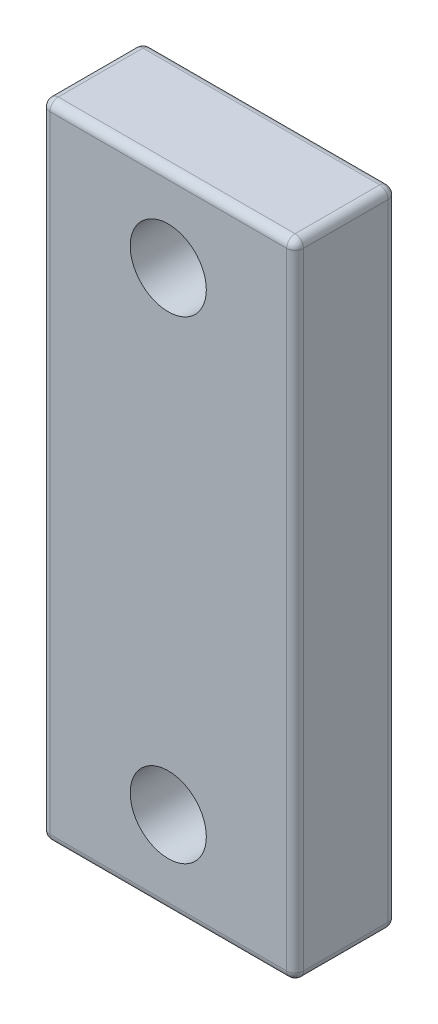
ISO-10303-21;
HEADER;
FILE_DESCRIPTION(('STEP AP214'),'2;1');
FILE_NAME('part.step','',(''),(''),'','','');
FILE_SCHEMA(('AUTOMOTIVE_DESIGN { 1 0 10303 214 1 1 1 1 }'));
ENDSEC;
DATA;
#1=APPLICATION_CONTEXT('core data for automotive mechanical design processes');
#2=APPLICATION_PROTOCOL_DEFINITION('international standard','automotive_design',2000,#1);
#3=PRODUCT_CONTEXT('',#1,'mechanical');
#4=PRODUCT('Part','Part','',(#3));
#5=PRODUCT_RELATED_PRODUCT_CATEGORY('part','',(#4));
#6=PRODUCT_DEFINITION_FORMATION('','',#4);
#7=PRODUCT_DEFINITION_CONTEXT('part definition',#1,'design');
#8=PRODUCT_DEFINITION('design','',#6,#7);
#9=PRODUCT_DEFINITION_SHAPE('','',#8);
#10=(LENGTH_UNIT() NAMED_UNIT(*) SI_UNIT(.MILLI.,.METRE.));
#11=(NAMED_UNIT(*) PLANE_ANGLE_UNIT() SI_UNIT($,.RADIAN.));
#12=(NAMED_UNIT(*) SI_UNIT($,.STERADIAN.) SOLID_ANGLE_UNIT());
#13=UNCERTAINTY_MEASURE_WITH_UNIT(LENGTH_MEASURE(1.E-05),#10,'distance_accuracy_value','');
#14=(GEOMETRIC_REPRESENTATION_CONTEXT(3) GLOBAL_UNCERTAINTY_ASSIGNED_CONTEXT((#13)) GLOBAL_UNIT_ASSIGNED_CONTEXT((#10,
#11,#12)) REPRESENTATION_CONTEXT('',''));
#15=CARTESIAN_POINT('',(0.,0.,0.));
#16=DIRECTION('',(0.,0.,1.));
#17=DIRECTION('',(1.,0.,0.));
#18=AXIS2_PLACEMENT_3D('',#15,#16,#17);
#19=CARTESIAN_POINT('',(0.,0.,-3.));
#20=DIRECTION('',(0.,0.,-1.));
#21=DIRECTION('',(-1.,0.,0.));
#22=AXIS2_PLACEMENT_3D('',#19,#20,#21);
#23=PLANE('',#22);
#24=CARTESIAN_POINT('',(0.,-14.,-3.));
#25=DIRECTION('',(0.,0.,1.));
#26=DIRECTION('',(1.,0.,0.));
#27=AXIS2_PLACEMENT_3D('',#24,#25,#26);
#28=CIRCLE('',#27,2.25);
#29=CARTESIAN_POINT('',(2.24999999999999,-14.,-3.));
#30=VERTEX_POINT('',#29);
#31=EDGE_CURVE('E243',#30,#30,#28,.T.);
#32=ORIENTED_EDGE('',*,*,#31,.T.);
#33=EDGE_LOOP('',(#32));
#34=FACE_BOUND('',#33,.T.);
#35=DIRECTION('',(-1.,0.,0.));
#36=VECTOR('',#35,1.);
#37=CARTESIAN_POINT('',(-2.,-10.5,-3.));
#38=LINE('',#37,#36);
#39=CARTESIAN_POINT('',(7.,-10.5,-3.));
#40=VERTEX_POINT('',#39);
#41=CARTESIAN_POINT('',(-7.,-10.5,-3.));
#42=VERTEX_POINT('',#41);
#43=EDGE_CURVE('E66',#40,#42,#38,.T.);
#44=ORIENTED_EDGE('',*,*,#43,.F.);
#45=DIRECTION('',(0.,1.,0.));
#46=VECTOR('',#45,1.);
#47=CARTESIAN_POINT('',(7.,-19.,-3.));
#48=LINE('',#47,#46);
#49=CARTESIAN_POINT('',(7.,-18.5,-3.));
#50=VERTEX_POINT('',#49);
#51=EDGE_CURVE('E275',#40,#50,#48,.F.);
#52=ORIENTED_EDGE('',*,*,#51,.T.);
#53=DIRECTION('',(1.,0.,0.));
#54=VECTOR('',#53,1.);
#55=CARTESIAN_POINT('',(-7.5,-18.5,-3.));
#56=LINE('',#55,#54);
#57=CARTESIAN_POINT('',(-7.,-18.5,-3.));
#58=VERTEX_POINT('',#57);
#59=EDGE_CURVE('E279',#50,#58,#56,.F.);
#60=ORIENTED_EDGE('',*,*,#59,.T.);
#61=DIRECTION('',(0.,-1.,0.));
#62=VECTOR('',#61,1.);
#63=CARTESIAN_POINT('',(-7.,19.,-3.));
#64=LINE('',#63,#62);
#65=EDGE_CURVE('E272',#58,#42,#64,.F.);
#66=ORIENTED_EDGE('',*,*,#65,.T.);
#67=EDGE_LOOP('',(#44,#52,#60,#66));
#68=FACE_BOUND('',#67,.T.);
#69=ADVANCED_FACE('F41',(#34,#68),#23,.T.);
#70=CARTESIAN_POINT('',(7.,18.5,-3.));
#71=VERTEX_POINT('',#70);
#72=CARTESIAN_POINT('',(7.,10.5,-3.));
#73=VERTEX_POINT('',#72);
#74=EDGE_CURVE('E276',#71,#73,#48,.F.);
#75=ORIENTED_EDGE('',*,*,#74,.T.);
#76=DIRECTION('',(-1.,0.,0.));
#77=VECTOR('',#76,1.);
#78=CARTESIAN_POINT('',(-2.,10.5,-3.));
#79=LINE('',#78,#77);
#80=CARTESIAN_POINT('',(-7.,10.5,-3.));
#81=VERTEX_POINT('',#80);
#82=EDGE_CURVE('E220',#73,#81,#79,.T.);
#83=ORIENTED_EDGE('',*,*,#82,.T.);
#84=CARTESIAN_POINT('',(-7.,18.5,-3.));
#85=VERTEX_POINT('',#84);
#86=EDGE_CURVE('E271',#81,#85,#64,.F.);
#87=ORIENTED_EDGE('',*,*,#86,.T.);
#88=DIRECTION('',(-1.,0.,0.));
#89=VECTOR('',#88,1.);
#90=CARTESIAN_POINT('',(7.5,18.5,-3.));
#91=LINE('',#90,#89);
#92=EDGE_CURVE('E269',#85,#71,#91,.F.);
#93=ORIENTED_EDGE('',*,*,#92,.T.);
#94=EDGE_LOOP('',(#75,#83,#87,#93));
#95=FACE_BOUND('',#94,.T.);
#96=CARTESIAN_POINT('',(0.,14.,-3.));
#97=DIRECTION('',(0.,0.,1.));
#98=DIRECTION('',(1.,0.,0.));
#99=AXIS2_PLACEMENT_3D('',#96,#97,#98);
#100=CIRCLE('',#99,2.25);
#101=CARTESIAN_POINT('',(2.24999999999999,14.,-3.));
#102=VERTEX_POINT('',#101);
#103=EDGE_CURVE('E242',#102,#102,#100,.T.);
#104=ORIENTED_EDGE('',*,*,#103,.T.);
#105=EDGE_LOOP('',(#104));
#106=FACE_BOUND('',#105,.T.);
#107=ADVANCED_FACE('F419',(#95,#106),#23,.T.);
#108=CARTESIAN_POINT('',(0.,0.,3.));
#109=DIRECTION('',(0.,0.,-1.));
#110=DIRECTION('',(-1.,0.,0.));
#111=AXIS2_PLACEMENT_3D('',#108,#109,#110);
#112=PLANE('',#111);
#113=DIRECTION('',(0.,-1.,0.));
#114=VECTOR('',#113,1.);
#115=CARTESIAN_POINT('',(-7.,0.,3.));
#116=LINE('',#115,#114);
#117=CARTESIAN_POINT('',(-7.,18.5,3.));
#118=VERTEX_POINT('',#117);
#119=CARTESIAN_POINT('',(-7.,-18.5,3.));
#120=VERTEX_POINT('',#119);
#121=EDGE_CURVE('E253',#118,#120,#116,.T.);
#122=ORIENTED_EDGE('',*,*,#121,.T.);
#123=DIRECTION('',(1.,0.,0.));
#124=VECTOR('',#123,1.);
#125=CARTESIAN_POINT('',(0.,-18.5,3.));
#126=LINE('',#125,#124);
#127=CARTESIAN_POINT('',(7.,-18.5,3.));
#128=VERTEX_POINT('',#127);
#129=EDGE_CURVE('E257',#120,#128,#126,.T.);
#130=ORIENTED_EDGE('',*,*,#129,.T.);
#131=DIRECTION('',(0.,1.,0.));
#132=VECTOR('',#131,1.);
#133=CARTESIAN_POINT('',(7.,0.,3.));
#134=LINE('',#133,#132);
#135=CARTESIAN_POINT('',(7.,18.5,3.));
#136=VERTEX_POINT('',#135);
#137=EDGE_CURVE('E255',#128,#136,#134,.T.);
#138=ORIENTED_EDGE('',*,*,#137,.T.);
#139=DIRECTION('',(-1.,0.,0.));
#140=VECTOR('',#139,1.);
#141=CARTESIAN_POINT('',(0.,18.5,3.));
#142=LINE('',#141,#140);
#143=EDGE_CURVE('E249',#136,#118,#142,.T.);
#144=ORIENTED_EDGE('',*,*,#143,.T.);
#145=EDGE_LOOP('',(#122,#130,#138,#144));
#146=FACE_BOUND('',#145,.T.);
#147=CARTESIAN_POINT('',(0.,14.,3.));
#148=DIRECTION('',(0.,0.,1.));
#149=DIRECTION('',(1.,0.,0.));
#150=AXIS2_PLACEMENT_3D('',#147,#148,#149);
#151=CIRCLE('',#150,2.25);
#152=CARTESIAN_POINT('',(2.24999999999999,14.,3.));
#153=VERTEX_POINT('',#152);
#154=EDGE_CURVE('E246',#153,#153,#151,.T.);
#155=ORIENTED_EDGE('',*,*,#154,.F.);
#156=EDGE_LOOP('',(#155));
#157=FACE_BOUND('',#156,.T.);
#158=CARTESIAN_POINT('',(0.,-14.,3.));
#159=DIRECTION('',(0.,0.,1.));
#160=DIRECTION('',(1.,0.,0.));
#161=AXIS2_PLACEMENT_3D('',#158,#159,#160);
#162=CIRCLE('',#161,2.25);
#163=CARTESIAN_POINT('',(2.24999999999999,-14.,3.));
#164=VERTEX_POINT('',#163);
#165=EDGE_CURVE('E239',#164,#164,#162,.T.);
#166=ORIENTED_EDGE('',*,*,#165,.F.);
#167=EDGE_LOOP('',(#166));
#168=FACE_BOUND('',#167,.T.);
#169=ADVANCED_FACE('F438',(#146,#157,#168),#112,.F.);
#170=CARTESIAN_POINT('',(7.5,-19.,3.));
#171=DIRECTION('',(-1.,0.,0.));
#172=DIRECTION('',(0.,-1.,0.));
#173=AXIS2_PLACEMENT_3D('',#170,#171,#172);
#174=PLANE('',#173);
#175=DIRECTION('',(0.,1.,0.));
#176=VECTOR('',#175,1.);
#177=CARTESIAN_POINT('',(7.5,-19.,2.5));
#178=LINE('',#177,#176);
#179=CARTESIAN_POINT('',(7.5,18.5,2.5));
#180=VERTEX_POINT('',#179);
#181=CARTESIAN_POINT('',(7.5,-18.5,2.5));
#182=VERTEX_POINT('',#181);
#183=EDGE_CURVE('E286',#180,#182,#178,.F.);
#184=ORIENTED_EDGE('',*,*,#183,.T.);
#185=DIRECTION('',(0.,0.,-1.));
#186=VECTOR('',#185,1.);
#187=CARTESIAN_POINT('',(7.5,-18.5,3.));
#188=LINE('',#187,#186);
#189=CARTESIAN_POINT('',(7.5,-18.5,-2.5));
#190=VERTEX_POINT('',#189);
#191=EDGE_CURVE('E288',#182,#190,#188,.T.);
#192=ORIENTED_EDGE('',*,*,#191,.T.);
#193=DIRECTION('',(0.,1.,0.));
#194=VECTOR('',#193,1.);
#195=CARTESIAN_POINT('',(7.5,19.,-2.5));
#196=LINE('',#195,#194);
#197=CARTESIAN_POINT('',(7.5,18.5,-2.5));
#198=VERTEX_POINT('',#197);
#199=EDGE_CURVE('E284',#190,#198,#196,.T.);
#200=ORIENTED_EDGE('',*,*,#199,.T.);
#201=DIRECTION('',(0.,0.,-1.));
#202=VECTOR('',#201,1.);
#203=CARTESIAN_POINT('',(7.5,18.5,3.));
#204=LINE('',#203,#202);
#205=EDGE_CURVE('E282',#198,#180,#204,.F.);
#206=ORIENTED_EDGE('',*,*,#205,.T.);
#207=EDGE_LOOP('',(#184,#192,#200,#206));
#208=FACE_BOUND('',#207,.T.);
#209=ADVANCED_FACE('F450',(#208),#174,.F.);
#210=CARTESIAN_POINT('',(-7.5,19.,3.));
#211=DIRECTION('',(0.,-1.,0.));
#212=DIRECTION('',(0.,0.,-1.));
#213=AXIS2_PLACEMENT_3D('',#210,#211,#212);
#214=PLANE('',#213);
#215=DIRECTION('',(-1.,0.,0.));
#216=VECTOR('',#215,1.);
#217=CARTESIAN_POINT('',(-7.5,19.,2.5));
#218=LINE('',#217,#216);
#219=CARTESIAN_POINT('',(-7.,19.,2.5));
#220=VERTEX_POINT('',#219);
#221=CARTESIAN_POINT('',(7.,19.,2.5));
#222=VERTEX_POINT('',#221);
#223=EDGE_CURVE('E50',#220,#222,#218,.F.);
#224=ORIENTED_EDGE('',*,*,#223,.T.);
#225=DIRECTION('',(0.,0.,-1.));
#226=VECTOR('',#225,1.);
#227=CARTESIAN_POINT('',(7.,19.,3.));
#228=LINE('',#227,#226);
#229=CARTESIAN_POINT('',(7.,19.,-2.5));
#230=VERTEX_POINT('',#229);
#231=EDGE_CURVE('E11',#222,#230,#228,.T.);
#232=ORIENTED_EDGE('',*,*,#231,.T.);
#233=DIRECTION('',(-1.,0.,0.));
#234=VECTOR('',#233,1.);
#235=CARTESIAN_POINT('',(-7.5,19.,-2.5));
#236=LINE('',#235,#234);
#237=CARTESIAN_POINT('',(-7.,19.,-2.5));
#238=VERTEX_POINT('',#237);
#239=EDGE_CURVE('E300',#230,#238,#236,.T.);
#240=ORIENTED_EDGE('',*,*,#239,.T.);
#241=DIRECTION('',(0.,0.,-1.));
#242=VECTOR('',#241,1.);
#243=CARTESIAN_POINT('',(-7.,19.,3.));
#244=LINE('',#243,#242);
#245=EDGE_CURVE('E302',#238,#220,#244,.F.);
#246=ORIENTED_EDGE('',*,*,#245,.T.);
#247=EDGE_LOOP('',(#224,#232,#240,#246));
#248=FACE_BOUND('',#247,.T.);
#249=ADVANCED_FACE('F397',(#248),#214,.F.);
#250=CARTESIAN_POINT('',(-7.5,-19.,3.));
#251=DIRECTION('',(1.,0.,0.));
#252=DIRECTION('',(0.,0.,-1.));
#253=AXIS2_PLACEMENT_3D('',#250,#251,#252);
#254=PLANE('',#253);
#255=DIRECTION('',(0.,0.,-1.));
#256=VECTOR('',#255,1.);
#257=CARTESIAN_POINT('',(-7.5,-18.5,3.));
#258=LINE('',#257,#256);
#259=CARTESIAN_POINT('',(-7.5,-18.5,-2.5));
#260=VERTEX_POINT('',#259);
#261=CARTESIAN_POINT('',(-7.5,-18.5,2.5));
#262=VERTEX_POINT('',#261);
#263=EDGE_CURVE('E295',#260,#262,#258,.F.);
#264=ORIENTED_EDGE('',*,*,#263,.T.);
#265=DIRECTION('',(0.,-1.,0.));
#266=VECTOR('',#265,1.);
#267=CARTESIAN_POINT('',(-7.5,-19.,2.5));
#268=LINE('',#267,#266);
#269=CARTESIAN_POINT('',(-7.5,18.5,2.5));
#270=VERTEX_POINT('',#269);
#271=EDGE_CURVE('E297',#262,#270,#268,.F.);
#272=ORIENTED_EDGE('',*,*,#271,.T.);
#273=DIRECTION('',(0.,0.,-1.));
#274=VECTOR('',#273,1.);
#275=CARTESIAN_POINT('',(-7.5,18.5,3.));
#276=LINE('',#275,#274);
#277=CARTESIAN_POINT('',(-7.5,18.5,-2.5));
#278=VERTEX_POINT('',#277);
#279=EDGE_CURVE('E291',#270,#278,#276,.T.);
#280=ORIENTED_EDGE('',*,*,#279,.T.);
#281=DIRECTION('',(0.,-1.,0.));
#282=VECTOR('',#281,1.);
#283=CARTESIAN_POINT('',(-7.5,-19.,-2.5));
#284=LINE('',#283,#282);
#285=EDGE_CURVE('E293',#278,#260,#284,.T.);
#286=ORIENTED_EDGE('',*,*,#285,.T.);
#287=EDGE_LOOP('',(#264,#272,#280,#286));
#288=FACE_BOUND('',#287,.T.);
#289=ADVANCED_FACE('F388',(#288),#254,.F.);
#290=CARTESIAN_POINT('',(-7.5,-19.,3.));
#291=DIRECTION('',(0.,1.,0.));
#292=DIRECTION('',(0.,0.,1.));
#293=AXIS2_PLACEMENT_3D('',#290,#291,#292);
#294=PLANE('',#293);
#295=DIRECTION('',(1.,0.,0.));
#296=VECTOR('',#295,1.);
#297=CARTESIAN_POINT('',(7.5,-19.,-2.5));
#298=LINE('',#297,#296);
#299=CARTESIAN_POINT('',(-7.,-19.,-2.5));
#300=VERTEX_POINT('',#299);
#301=CARTESIAN_POINT('',(7.,-19.,-2.5));
#302=VERTEX_POINT('',#301);
#303=EDGE_CURVE('E262',#300,#302,#298,.T.);
#304=ORIENTED_EDGE('',*,*,#303,.T.);
#305=DIRECTION('',(0.,0.,-1.));
#306=VECTOR('',#305,1.);
#307=CARTESIAN_POINT('',(7.,-19.,3.));
#308=LINE('',#307,#306);
#309=CARTESIAN_POINT('',(7.,-19.,2.5));
#310=VERTEX_POINT('',#309);
#311=EDGE_CURVE('E267',#302,#310,#308,.F.);
#312=ORIENTED_EDGE('',*,*,#311,.T.);
#313=DIRECTION('',(1.,0.,0.));
#314=VECTOR('',#313,1.);
#315=CARTESIAN_POINT('',(-7.5,-19.,2.5));
#316=LINE('',#315,#314);
#317=CARTESIAN_POINT('',(-7.,-19.,2.5));
#318=VERTEX_POINT('',#317);
#319=EDGE_CURVE('E264',#310,#318,#316,.F.);
#320=ORIENTED_EDGE('',*,*,#319,.T.);
#321=DIRECTION('',(0.,0.,-1.));
#322=VECTOR('',#321,1.);
#323=CARTESIAN_POINT('',(-7.,-19.,3.));
#324=LINE('',#323,#322);
#325=EDGE_CURVE('E260',#318,#300,#324,.T.);
#326=ORIENTED_EDGE('',*,*,#325,.T.);
#327=EDGE_LOOP('',(#304,#312,#320,#326));
#328=FACE_BOUND('',#327,.T.);
#329=ADVANCED_FACE('F443',(#328),#294,.F.);
#330=CARTESIAN_POINT('',(0.,14.,3.));
#331=DIRECTION('',(0.,0.,-1.));
#332=DIRECTION('',(-1.,0.,0.));
#333=AXIS2_PLACEMENT_3D('',#330,#331,#332);
#334=CYLINDRICAL_SURFACE('',#333,2.25);
#335=ORIENTED_EDGE('',*,*,#154,.T.);
#336=EDGE_LOOP('',(#335));
#337=FACE_BOUND('',#336,.T.);
#338=ORIENTED_EDGE('',*,*,#103,.F.);
#339=EDGE_LOOP('',(#338));
#340=FACE_BOUND('',#339,.T.);
#341=ADVANCED_FACE('F428',(#337,#340),#334,.F.);
#342=CARTESIAN_POINT('',(0.,-14.,3.));
#343=DIRECTION('',(0.,0.,-1.));
#344=DIRECTION('',(-1.,0.,0.));
#345=AXIS2_PLACEMENT_3D('',#342,#343,#344);
#346=CYLINDRICAL_SURFACE('',#345,2.25);
#347=ORIENTED_EDGE('',*,*,#165,.T.);
#348=EDGE_LOOP('',(#347));
#349=FACE_BOUND('',#348,.T.);
#350=ORIENTED_EDGE('',*,*,#31,.F.);
#351=EDGE_LOOP('',(#350));
#352=FACE_BOUND('',#351,.T.);
#353=ADVANCED_FACE('F422',(#349,#352),#346,.F.);
#354=CARTESIAN_POINT('',(-7.5,18.5,-2.5));
#355=DIRECTION('',(1.,0.,0.));
#356=DIRECTION('',(0.,0.,-1.));
#357=AXIS2_PLACEMENT_3D('',#354,#355,#356);
#358=CYLINDRICAL_SURFACE('',#357,0.5);
#359=CARTESIAN_POINT('',(-7.,18.5,-2.5));
#360=DIRECTION('',(-1.,0.,0.));
#361=DIRECTION('',(0.,0.,1.));
#362=AXIS2_PLACEMENT_3D('',#359,#360,#361);
#363=CIRCLE('',#362,0.5);
#364=EDGE_CURVE('E45',#238,#85,#363,.T.);
#365=ORIENTED_EDGE('',*,*,#364,.F.);
#366=ORIENTED_EDGE('',*,*,#239,.F.);
#367=CARTESIAN_POINT('',(7.,18.5,-2.5));
#368=DIRECTION('',(1.,0.,0.));
#369=DIRECTION('',(0.,1.,0.));
#370=AXIS2_PLACEMENT_3D('',#367,#368,#369);
#371=CIRCLE('',#370,0.5);
#372=EDGE_CURVE('E363',#71,#230,#371,.T.);
#373=ORIENTED_EDGE('',*,*,#372,.F.);
#374=ORIENTED_EDGE('',*,*,#92,.F.);
#375=EDGE_LOOP('',(#365,#366,#373,#374));
#376=FACE_BOUND('',#375,.T.);
#377=ADVANCED_FACE('F43',(#376),#358,.T.);
#378=CARTESIAN_POINT('',(-7.,18.5,-2.5));
#379=DIRECTION('',(0.,0.,-1.));
#380=DIRECTION('',(-1.,0.,0.));
#381=AXIS2_PLACEMENT_3D('',#378,#379,#380);
#382=SPHERICAL_SURFACE('',#381,0.5);
#383=CARTESIAN_POINT('',(-7.,18.5,-2.5));
#384=DIRECTION('',(0.,0.,-1.));
#385=DIRECTION('',(-1.,0.,0.));
#386=AXIS2_PLACEMENT_3D('',#383,#384,#385);
#387=CIRCLE('',#386,0.5);
#388=EDGE_CURVE('E358',#238,#278,#387,.F.);
#389=ORIENTED_EDGE('',*,*,#388,.F.);
#390=ORIENTED_EDGE('',*,*,#364,.T.);
#391=CARTESIAN_POINT('',(-7.,18.5,-2.5));
#392=DIRECTION('',(0.,1.,0.));
#393=DIRECTION('',(0.,0.,1.));
#394=AXIS2_PLACEMENT_3D('',#391,#392,#393);
#395=CIRCLE('',#394,0.5);
#396=EDGE_CURVE('E361',#278,#85,#395,.F.);
#397=ORIENTED_EDGE('',*,*,#396,.F.);
#398=EDGE_LOOP('',(#389,#390,#397));
#399=FACE_BOUND('',#398,.T.);
#400=ADVANCED_FACE('F375',(#399),#382,.T.);
#401=CARTESIAN_POINT('',(7.,18.5,-2.5));
#402=DIRECTION('',(0.,1.,0.));
#403=DIRECTION('',(-1.,0.,0.));
#404=AXIS2_PLACEMENT_3D('',#401,#402,#403);
#405=SPHERICAL_SURFACE('',#404,0.5);
#406=CARTESIAN_POINT('',(7.,18.5,-2.5));
#407=DIRECTION('',(0.,1.,0.));
#408=DIRECTION('',(0.,0.,1.));
#409=AXIS2_PLACEMENT_3D('',#406,#407,#408);
#410=CIRCLE('',#409,0.5);
#411=EDGE_CURVE('E353',#71,#198,#410,.F.);
#412=ORIENTED_EDGE('',*,*,#411,.F.);
#413=ORIENTED_EDGE('',*,*,#372,.T.);
#414=CARTESIAN_POINT('',(7.,18.5,-2.5));
#415=DIRECTION('',(0.,0.,-1.));
#416=DIRECTION('',(-1.,0.,0.));
#417=AXIS2_PLACEMENT_3D('',#414,#415,#416);
#418=CIRCLE('',#417,0.5);
#419=EDGE_CURVE('E356',#198,#230,#418,.F.);
#420=ORIENTED_EDGE('',*,*,#419,.F.);
#421=EDGE_LOOP('',(#412,#413,#420));
#422=FACE_BOUND('',#421,.T.);
#423=ADVANCED_FACE('F413',(#422),#405,.T.);
#424=CARTESIAN_POINT('',(-7.,-19.,-2.5));
#425=DIRECTION('',(0.,1.,0.));
#426=DIRECTION('',(0.,0.,1.));
#427=AXIS2_PLACEMENT_3D('',#424,#425,#426);
#428=CYLINDRICAL_SURFACE('',#427,0.5);
#429=ORIENTED_EDGE('',*,*,#396,.T.);
#430=ORIENTED_EDGE('',*,*,#86,.F.);
#431=DIRECTION('',(0.,1.,0.));
#432=VECTOR('',#431,1.);
#433=CARTESIAN_POINT('',(-7.,-10.5,-3.));
#434=LINE('',#433,#432);
#435=EDGE_CURVE('E227',#42,#81,#434,.T.);
#436=ORIENTED_EDGE('',*,*,#435,.F.);
#437=ORIENTED_EDGE('',*,*,#65,.F.);
#438=CARTESIAN_POINT('',(-7.,-18.5,-2.5));
#439=DIRECTION('',(0.,-1.,0.));
#440=DIRECTION('',(0.,0.,-1.));
#441=AXIS2_PLACEMENT_3D('',#438,#439,#440);
#442=CIRCLE('',#441,0.5);
#443=EDGE_CURVE('E348',#260,#58,#442,.T.);
#444=ORIENTED_EDGE('',*,*,#443,.F.);
#445=ORIENTED_EDGE('',*,*,#285,.F.);
#446=EDGE_LOOP('',(#429,#430,#436,#437,#444,#445));
#447=FACE_BOUND('',#446,.T.);
#448=ADVANCED_FACE('F382',(#447),#428,.T.);
#449=CARTESIAN_POINT('',(-7.,18.5,3.));
#450=DIRECTION('',(0.,0.,-1.));
#451=DIRECTION('',(-1.,0.,0.));
#452=AXIS2_PLACEMENT_3D('',#449,#450,#451);
#453=CYLINDRICAL_SURFACE('',#452,0.5);
#454=ORIENTED_EDGE('',*,*,#388,.T.);
#455=ORIENTED_EDGE('',*,*,#279,.F.);
#456=CARTESIAN_POINT('',(-7.,18.5,2.5));
#457=DIRECTION('',(0.,0.,1.));
#458=DIRECTION('',(1.,0.,0.));
#459=AXIS2_PLACEMENT_3D('',#456,#457,#458);
#460=CIRCLE('',#459,0.5);
#461=EDGE_CURVE('E345',#220,#270,#460,.T.);
#462=ORIENTED_EDGE('',*,*,#461,.F.);
#463=ORIENTED_EDGE('',*,*,#245,.F.);
#464=EDGE_LOOP('',(#454,#455,#462,#463));
#465=FACE_BOUND('',#464,.T.);
#466=ADVANCED_FACE('F394',(#465),#453,.T.);
#467=CARTESIAN_POINT('',(0.,18.5,2.5));
#468=DIRECTION('',(-1.,0.,0.));
#469=DIRECTION('',(0.,0.,1.));
#470=AXIS2_PLACEMENT_3D('',#467,#468,#469);
#471=CYLINDRICAL_SURFACE('',#470,0.5);
#472=CARTESIAN_POINT('',(7.,18.5,2.5));
#473=DIRECTION('',(1.,0.,0.));
#474=DIRECTION('',(0.,0.,-1.));
#475=AXIS2_PLACEMENT_3D('',#472,#473,#474);
#476=CIRCLE('',#475,0.5);
#477=EDGE_CURVE('E339',#222,#136,#476,.T.);
#478=ORIENTED_EDGE('',*,*,#477,.F.);
#479=ORIENTED_EDGE('',*,*,#223,.F.);
#480=CARTESIAN_POINT('',(-7.,18.5,2.5));
#481=DIRECTION('',(-1.,0.,0.));
#482=DIRECTION('',(0.,0.,1.));
#483=AXIS2_PLACEMENT_3D('',#480,#481,#482);
#484=CIRCLE('',#483,0.5);
#485=EDGE_CURVE('E342',#118,#220,#484,.T.);
#486=ORIENTED_EDGE('',*,*,#485,.F.);
#487=ORIENTED_EDGE('',*,*,#143,.F.);
#488=EDGE_LOOP('',(#478,#479,#486,#487));
#489=FACE_BOUND('',#488,.T.);
#490=ADVANCED_FACE('F402',(#489),#471,.T.);
#491=CARTESIAN_POINT('',(7.,18.5,3.));
#492=DIRECTION('',(0.,0.,-1.));
#493=DIRECTION('',(-1.,0.,0.));
#494=AXIS2_PLACEMENT_3D('',#491,#492,#493);
#495=CYLINDRICAL_SURFACE('',#494,0.5);
#496=ORIENTED_EDGE('',*,*,#419,.T.);
#497=ORIENTED_EDGE('',*,*,#231,.F.);
#498=CARTESIAN_POINT('',(7.,18.5,2.5));
#499=DIRECTION('',(0.,0.,1.));
#500=DIRECTION('',(1.,0.,0.));
#501=AXIS2_PLACEMENT_3D('',#498,#499,#500);
#502=CIRCLE('',#501,0.5);
#503=EDGE_CURVE('E336',#180,#222,#502,.T.);
#504=ORIENTED_EDGE('',*,*,#503,.F.);
#505=ORIENTED_EDGE('',*,*,#205,.F.);
#506=EDGE_LOOP('',(#496,#497,#504,#505));
#507=FACE_BOUND('',#506,.T.);
#508=ADVANCED_FACE('F412',(#507),#495,.T.);
#509=CARTESIAN_POINT('',(7.,-19.,-2.5));
#510=DIRECTION('',(0.,-1.,0.));
#511=DIRECTION('',(1.,0.,0.));
#512=AXIS2_PLACEMENT_3D('',#509,#510,#511);
#513=CYLINDRICAL_SURFACE('',#512,0.5);
#514=ORIENTED_EDGE('',*,*,#411,.T.);
#515=ORIENTED_EDGE('',*,*,#199,.F.);
#516=CARTESIAN_POINT('',(7.,-18.5,-2.5));
#517=DIRECTION('',(0.,-1.,0.));
#518=DIRECTION('',(0.,0.,-1.));
#519=AXIS2_PLACEMENT_3D('',#516,#517,#518);
#520=CIRCLE('',#519,0.5);
#521=EDGE_CURVE('E333',#50,#190,#520,.T.);
#522=ORIENTED_EDGE('',*,*,#521,.F.);
#523=ORIENTED_EDGE('',*,*,#51,.F.);
#524=DIRECTION('',(0.,1.,0.));
#525=VECTOR('',#524,1.);
#526=CARTESIAN_POINT('',(7.,-10.5,-3.));
#527=LINE('',#526,#525);
#528=EDGE_CURVE('E195',#40,#73,#527,.T.);
#529=ORIENTED_EDGE('',*,*,#528,.T.);
#530=ORIENTED_EDGE('',*,*,#74,.F.);
#531=EDGE_LOOP('',(#514,#515,#522,#523,#529,#530));
#532=FACE_BOUND('',#531,.T.);
#533=ADVANCED_FACE('F417',(#532),#513,.T.);
#534=CARTESIAN_POINT('',(-7.5,-18.5,-2.5));
#535=DIRECTION('',(-1.,0.,0.));
#536=DIRECTION('',(0.,0.,1.));
#537=AXIS2_PLACEMENT_3D('',#534,#535,#536);
#538=CYLINDRICAL_SURFACE('',#537,0.5);
#539=CARTESIAN_POINT('',(-7.,-18.5,-2.5));
#540=DIRECTION('',(-1.,0.,0.));
#541=DIRECTION('',(0.,0.,1.));
#542=AXIS2_PLACEMENT_3D('',#539,#540,#541);
#543=CIRCLE('',#542,0.5);
#544=EDGE_CURVE('E350',#58,#300,#543,.T.);
#545=ORIENTED_EDGE('',*,*,#544,.F.);
#546=ORIENTED_EDGE('',*,*,#59,.F.);
#547=CARTESIAN_POINT('',(7.,-18.5,-2.5));
#548=DIRECTION('',(1.,0.,0.));
#549=DIRECTION('',(0.,0.,-1.));
#550=AXIS2_PLACEMENT_3D('',#547,#548,#549);
#551=CIRCLE('',#550,0.5);
#552=EDGE_CURVE('E330',#302,#50,#551,.T.);
#553=ORIENTED_EDGE('',*,*,#552,.F.);
#554=ORIENTED_EDGE('',*,*,#303,.F.);
#555=EDGE_LOOP('',(#545,#546,#553,#554));
#556=FACE_BOUND('',#555,.T.);
#557=ADVANCED_FACE('F496',(#556),#538,.T.);
#558=CARTESIAN_POINT('',(-7.,-18.5,-2.5));
#559=DIRECTION('',(0.,0.,-1.));
#560=DIRECTION('',(-1.,0.,0.));
#561=AXIS2_PLACEMENT_3D('',#558,#559,#560);
#562=SPHERICAL_SURFACE('',#561,0.5);
#563=ORIENTED_EDGE('',*,*,#443,.T.);
#564=ORIENTED_EDGE('',*,*,#544,.T.);
#565=CARTESIAN_POINT('',(-7.,-18.5,-2.5));
#566=DIRECTION('',(0.,0.,-1.));
#567=DIRECTION('',(-1.,0.,0.));
#568=AXIS2_PLACEMENT_3D('',#565,#566,#567);
#569=CIRCLE('',#568,0.5);
#570=EDGE_CURVE('E327',#260,#300,#569,.F.);
#571=ORIENTED_EDGE('',*,*,#570,.F.);
#572=EDGE_LOOP('',(#563,#564,#571));
#573=FACE_BOUND('',#572,.T.);
#574=ADVANCED_FACE('F492',(#573),#562,.T.);
#575=CARTESIAN_POINT('',(-7.,18.5,2.5));
#576=DIRECTION('',(0.,1.,0.));
#577=DIRECTION('',(0.,0.,1.));
#578=AXIS2_PLACEMENT_3D('',#575,#576,#577);
#579=SPHERICAL_SURFACE('',#578,0.5);
#580=ORIENTED_EDGE('',*,*,#485,.T.);
#581=ORIENTED_EDGE('',*,*,#461,.T.);
#582=CARTESIAN_POINT('',(-7.,18.5,2.5));
#583=DIRECTION('',(0.,1.,0.));
#584=DIRECTION('',(0.,0.,1.));
#585=AXIS2_PLACEMENT_3D('',#582,#583,#584);
#586=CIRCLE('',#585,0.5);
#587=EDGE_CURVE('E325',#118,#270,#586,.F.);
#588=ORIENTED_EDGE('',*,*,#587,.F.);
#589=EDGE_LOOP('',(#580,#581,#588));
#590=FACE_BOUND('',#589,.T.);
#591=ADVANCED_FACE('F489',(#590),#579,.T.);
#592=CARTESIAN_POINT('',(7.,18.5,2.5));
#593=DIRECTION('',(0.,1.,0.));
#594=DIRECTION('',(-1.,0.,0.));
#595=AXIS2_PLACEMENT_3D('',#592,#593,#594);
#596=SPHERICAL_SURFACE('',#595,0.5);
#597=ORIENTED_EDGE('',*,*,#503,.T.);
#598=ORIENTED_EDGE('',*,*,#477,.T.);
#599=CARTESIAN_POINT('',(7.,18.5,2.5));
#600=DIRECTION('',(0.,1.,0.));
#601=DIRECTION('',(0.,0.,1.));
#602=AXIS2_PLACEMENT_3D('',#599,#600,#601);
#603=CIRCLE('',#602,0.5);
#604=EDGE_CURVE('E322',#180,#136,#603,.F.);
#605=ORIENTED_EDGE('',*,*,#604,.F.);
#606=EDGE_LOOP('',(#597,#598,#605));
#607=FACE_BOUND('',#606,.T.);
#608=ADVANCED_FACE('F408',(#607),#596,.T.);
#609=CARTESIAN_POINT('',(7.,-18.5,-2.5));
#610=DIRECTION('',(0.,0.,-1.));
#611=DIRECTION('',(-1.,0.,0.));
#612=AXIS2_PLACEMENT_3D('',#609,#610,#611);
#613=SPHERICAL_SURFACE('',#612,0.5);
#614=ORIENTED_EDGE('',*,*,#552,.T.);
#615=ORIENTED_EDGE('',*,*,#521,.T.);
#616=CARTESIAN_POINT('',(7.,-18.5,-2.5));
#617=DIRECTION('',(0.,0.,-1.));
#618=DIRECTION('',(-1.,0.,0.));
#619=AXIS2_PLACEMENT_3D('',#616,#617,#618);
#620=CIRCLE('',#619,0.5);
#621=EDGE_CURVE('E320',#302,#190,#620,.F.);
#622=ORIENTED_EDGE('',*,*,#621,.F.);
#623=EDGE_LOOP('',(#614,#615,#622));
#624=FACE_BOUND('',#623,.T.);
#625=ADVANCED_FACE('F482',(#624),#613,.T.);
#626=CARTESIAN_POINT('',(-7.,-18.5,3.));
#627=DIRECTION('',(0.,0.,-1.));
#628=DIRECTION('',(-1.,0.,0.));
#629=AXIS2_PLACEMENT_3D('',#626,#627,#628);
#630=CYLINDRICAL_SURFACE('',#629,0.5);
#631=ORIENTED_EDGE('',*,*,#570,.T.);
#632=ORIENTED_EDGE('',*,*,#325,.F.);
#633=CARTESIAN_POINT('',(-7.,-18.5,2.5));
#634=DIRECTION('',(0.,0.,1.));
#635=DIRECTION('',(1.,0.,0.));
#636=AXIS2_PLACEMENT_3D('',#633,#634,#635);
#637=CIRCLE('',#636,0.5);
#638=EDGE_CURVE('E317',#262,#318,#637,.T.);
#639=ORIENTED_EDGE('',*,*,#638,.F.);
#640=ORIENTED_EDGE('',*,*,#263,.F.);
#641=EDGE_LOOP('',(#631,#632,#639,#640));
#642=FACE_BOUND('',#641,.T.);
#643=ADVANCED_FACE('F478',(#642),#630,.T.);
#644=CARTESIAN_POINT('',(-7.,0.,2.5));
#645=DIRECTION('',(0.,-1.,0.));
#646=DIRECTION('',(0.,0.,-1.));
#647=AXIS2_PLACEMENT_3D('',#644,#645,#646);
#648=CYLINDRICAL_SURFACE('',#647,0.5);
#649=ORIENTED_EDGE('',*,*,#587,.T.);
#650=ORIENTED_EDGE('',*,*,#271,.F.);
#651=CARTESIAN_POINT('',(-7.,-18.5,2.5));
#652=DIRECTION('',(0.,-1.,0.));
#653=DIRECTION('',(0.,0.,-1.));
#654=AXIS2_PLACEMENT_3D('',#651,#652,#653);
#655=CIRCLE('',#654,0.5);
#656=EDGE_CURVE('E314',#120,#262,#655,.T.);
#657=ORIENTED_EDGE('',*,*,#656,.F.);
#658=ORIENTED_EDGE('',*,*,#121,.F.);
#659=EDGE_LOOP('',(#649,#650,#657,#658));
#660=FACE_BOUND('',#659,.T.);
#661=ADVANCED_FACE('F474',(#660),#648,.T.);
#662=CARTESIAN_POINT('',(7.,0.,2.5));
#663=DIRECTION('',(0.,1.,0.));
#664=DIRECTION('',(-1.,0.,0.));
#665=AXIS2_PLACEMENT_3D('',#662,#663,#664);
#666=CYLINDRICAL_SURFACE('',#665,0.5);
#667=ORIENTED_EDGE('',*,*,#604,.T.);
#668=ORIENTED_EDGE('',*,*,#137,.F.);
#669=CARTESIAN_POINT('',(7.,-18.5,2.5));
#670=DIRECTION('',(0.,-1.,0.));
#671=DIRECTION('',(0.,0.,-1.));
#672=AXIS2_PLACEMENT_3D('',#669,#670,#671);
#673=CIRCLE('',#672,0.5);
#674=EDGE_CURVE('E311',#182,#128,#673,.T.);
#675=ORIENTED_EDGE('',*,*,#674,.F.);
#676=ORIENTED_EDGE('',*,*,#183,.F.);
#677=EDGE_LOOP('',(#667,#668,#675,#676));
#678=FACE_BOUND('',#677,.T.);
#679=ADVANCED_FACE('F470',(#678),#666,.T.);
#680=CARTESIAN_POINT('',(7.,-18.5,3.));
#681=DIRECTION('',(0.,0.,-1.));
#682=DIRECTION('',(-1.,0.,0.));
#683=AXIS2_PLACEMENT_3D('',#680,#681,#682);
#684=CYLINDRICAL_SURFACE('',#683,0.5);
#685=ORIENTED_EDGE('',*,*,#621,.T.);
#686=ORIENTED_EDGE('',*,*,#191,.F.);
#687=CARTESIAN_POINT('',(7.,-18.5,2.5));
#688=DIRECTION('',(0.,0.,1.));
#689=DIRECTION('',(1.,0.,0.));
#690=AXIS2_PLACEMENT_3D('',#687,#688,#689);
#691=CIRCLE('',#690,0.5);
#692=EDGE_CURVE('E308',#310,#182,#691,.T.);
#693=ORIENTED_EDGE('',*,*,#692,.F.);
#694=ORIENTED_EDGE('',*,*,#311,.F.);
#695=EDGE_LOOP('',(#685,#686,#693,#694));
#696=FACE_BOUND('',#695,.T.);
#697=ADVANCED_FACE('F466',(#696),#684,.T.);
#698=CARTESIAN_POINT('',(-7.,-18.5,2.5));
#699=DIRECTION('',(-1.,0.,0.));
#700=DIRECTION('',(0.,0.,1.));
#701=AXIS2_PLACEMENT_3D('',#698,#699,#700);
#702=SPHERICAL_SURFACE('',#701,0.5);
#703=ORIENTED_EDGE('',*,*,#656,.T.);
#704=ORIENTED_EDGE('',*,*,#638,.T.);
#705=CARTESIAN_POINT('',(-7.,-18.5,2.5));
#706=DIRECTION('',(-1.,0.,0.));
#707=DIRECTION('',(0.,0.,1.));
#708=AXIS2_PLACEMENT_3D('',#705,#706,#707);
#709=CIRCLE('',#708,0.5);
#710=EDGE_CURVE('E306',#120,#318,#709,.F.);
#711=ORIENTED_EDGE('',*,*,#710,.F.);
#712=EDGE_LOOP('',(#703,#704,#711));
#713=FACE_BOUND('',#712,.T.);
#714=ADVANCED_FACE('F462',(#713),#702,.T.);
#715=CARTESIAN_POINT('',(7.,-18.5,2.5));
#716=DIRECTION('',(1.,0.,0.));
#717=DIRECTION('',(0.,0.,-1.));
#718=AXIS2_PLACEMENT_3D('',#715,#716,#717);
#719=SPHERICAL_SURFACE('',#718,0.5);
#720=ORIENTED_EDGE('',*,*,#692,.T.);
#721=ORIENTED_EDGE('',*,*,#674,.T.);
#722=CARTESIAN_POINT('',(7.,-18.5,2.5));
#723=DIRECTION('',(1.,0.,0.));
#724=DIRECTION('',(0.,0.,-1.));
#725=AXIS2_PLACEMENT_3D('',#722,#723,#724);
#726=CIRCLE('',#725,0.5);
#727=EDGE_CURVE('E236',#310,#128,#726,.F.);
#728=ORIENTED_EDGE('',*,*,#727,.F.);
#729=EDGE_LOOP('',(#720,#721,#728));
#730=FACE_BOUND('',#729,.T.);
#731=ADVANCED_FACE('F458',(#730),#719,.T.);
#732=CARTESIAN_POINT('',(0.,-18.5,2.5));
#733=DIRECTION('',(1.,0.,0.));
#734=DIRECTION('',(0.,0.,-1.));
#735=AXIS2_PLACEMENT_3D('',#732,#733,#734);
#736=CYLINDRICAL_SURFACE('',#735,0.5);
#737=ORIENTED_EDGE('',*,*,#710,.T.);
#738=ORIENTED_EDGE('',*,*,#319,.F.);
#739=ORIENTED_EDGE('',*,*,#727,.T.);
#740=ORIENTED_EDGE('',*,*,#129,.F.);
#741=EDGE_LOOP('',(#737,#738,#739,#740));
#742=FACE_BOUND('',#741,.T.);
#743=ADVANCED_FACE('F454',(#742),#736,.T.);
#744=CARTESIAN_POINT('',(-4.5,-10.5,-2.));
#745=DIRECTION('',(0.371390676354104,0.,0.928476690885259));
#746=DIRECTION('',(0.928476690885259,0.,-0.371390676354104));
#747=AXIS2_PLACEMENT_3D('',#744,#745,#746);
#748=PLANE('',#747);
#749=DIRECTION('',(0.928476690885259,0.,-0.371390676354104));
#750=VECTOR('',#749,1.);
#751=CARTESIAN_POINT('',(-4.5,10.5,-2.));
#752=LINE('',#751,#750);
#753=CARTESIAN_POINT('',(-4.5,10.5,-2.));
#754=VERTEX_POINT('',#753);
#755=CARTESIAN_POINT('',(-2.25,10.5,-2.9));
#756=VERTEX_POINT('',#755);
#757=EDGE_CURVE('E223',#754,#756,#752,.T.);
#758=ORIENTED_EDGE('',*,*,#757,.T.);
#759=DIRECTION('',(0.,-1.,0.));
#760=VECTOR('',#759,1.);
#761=CARTESIAN_POINT('',(-2.25,-10.5,-2.9));
#762=LINE('',#761,#760);
#763=CARTESIAN_POINT('',(-2.25,-10.5,-2.9));
#764=VERTEX_POINT('',#763);
#765=EDGE_CURVE('E217',#756,#764,#762,.T.);
#766=ORIENTED_EDGE('',*,*,#765,.T.);
#767=DIRECTION('',(0.928476690885259,0.,-0.371390676354104));
#768=VECTOR('',#767,1.);
#769=CARTESIAN_POINT('',(-4.5,-10.5,-2.));
#770=LINE('',#769,#768);
#771=CARTESIAN_POINT('',(-4.5,-10.5,-2.));
#772=VERTEX_POINT('',#771);
#773=EDGE_CURVE('E225',#772,#764,#770,.T.);
#774=ORIENTED_EDGE('',*,*,#773,.F.);
#775=DIRECTION('',(0.,1.,0.));
#776=VECTOR('',#775,1.);
#777=CARTESIAN_POINT('',(-4.5,-10.5,-2.));
#778=LINE('',#777,#776);
#779=EDGE_CURVE('E234',#772,#754,#778,.T.);
#780=ORIENTED_EDGE('',*,*,#779,.T.);
#781=EDGE_LOOP('',(#758,#766,#774,#780));
#782=FACE_BOUND('',#781,.T.);
#783=ADVANCED_FACE('F457',(#782),#748,.F.);
#784=CARTESIAN_POINT('',(-7.,-10.5,-3.));
#785=DIRECTION('',(-0.371390676354104,0.,0.928476690885259));
#786=DIRECTION('',(0.92847669088526,0.,0.371390676354104));
#787=AXIS2_PLACEMENT_3D('',#784,#785,#786);
#788=PLANE('',#787);
#789=DIRECTION('',(0.928476690885259,0.,0.371390676354104));
#790=VECTOR('',#789,1.);
#791=CARTESIAN_POINT('',(-7.,10.5,-3.));
#792=LINE('',#791,#790);
#793=EDGE_CURVE('E229',#81,#754,#792,.T.);
#794=ORIENTED_EDGE('',*,*,#793,.T.);
#795=ORIENTED_EDGE('',*,*,#779,.F.);
#796=DIRECTION('',(0.928476690885259,0.,0.371390676354104));
#797=VECTOR('',#796,1.);
#798=CARTESIAN_POINT('',(-7.,-10.5,-3.));
#799=LINE('',#798,#797);
#800=EDGE_CURVE('E222',#42,#772,#799,.T.);
#801=ORIENTED_EDGE('',*,*,#800,.F.);
#802=ORIENTED_EDGE('',*,*,#435,.T.);
#803=EDGE_LOOP('',(#794,#795,#801,#802));
#804=FACE_BOUND('',#803,.T.);
#805=ADVANCED_FACE('F601',(#804),#788,.F.);
#806=CARTESIAN_POINT('',(0.,-10.5,0.));
#807=DIRECTION('',(0.,1.,0.));
#808=DIRECTION('',(0.,0.,1.));
#809=AXIS2_PLACEMENT_3D('',#806,#807,#808);
#810=PLANE('',#809);
#811=ORIENTED_EDGE('',*,*,#773,.T.);
#812=DIRECTION('',(0.928476690885259,0.,0.371390676354104));
#813=VECTOR('',#812,1.);
#814=CARTESIAN_POINT('',(-2.5,-10.5,-3.));
#815=LINE('',#814,#813);
#816=CARTESIAN_POINT('',(0.,-10.5,-2.));
#817=VERTEX_POINT('',#816);
#818=EDGE_CURVE('E207',#764,#817,#815,.T.);
#819=ORIENTED_EDGE('',*,*,#818,.T.);
#820=DIRECTION('',(0.928476690885259,0.,-0.371390676354104));
#821=VECTOR('',#820,1.);
#822=CARTESIAN_POINT('',(0.,-10.5,-2.));
#823=LINE('',#822,#821);
#824=CARTESIAN_POINT('',(2.25,-10.5,-2.9));
#825=VERTEX_POINT('',#824);
#826=EDGE_CURVE('E183',#817,#825,#823,.T.);
#827=ORIENTED_EDGE('',*,*,#826,.T.);
#828=DIRECTION('',(0.928476690885259,0.,0.371390676354104));
#829=VECTOR('',#828,1.);
#830=CARTESIAN_POINT('',(2.,-10.5,-3.));
#831=LINE('',#830,#829);
#832=CARTESIAN_POINT('',(4.5,-10.5,-2.));
#833=VERTEX_POINT('',#832);
#834=EDGE_CURVE('E175',#825,#833,#831,.T.);
#835=ORIENTED_EDGE('',*,*,#834,.T.);
#836=DIRECTION('',(0.928476690885259,0.,-0.371390676354104));
#837=VECTOR('',#836,1.);
#838=CARTESIAN_POINT('',(4.5,-10.5,-2.));
#839=LINE('',#838,#837);
#840=EDGE_CURVE('E180',#833,#40,#839,.T.);
#841=ORIENTED_EDGE('',*,*,#840,.T.);
#842=ORIENTED_EDGE('',*,*,#43,.T.);
#843=ORIENTED_EDGE('',*,*,#800,.T.);
#844=EDGE_LOOP('',(#811,#819,#827,#835,#841,#842,#843));
#845=FACE_BOUND('',#844,.T.);
#846=ADVANCED_FACE('F178',(#845),#810,.T.);
#847=CARTESIAN_POINT('',(0.,10.5,0.));
#848=DIRECTION('',(0.,1.,0.));
#849=DIRECTION('',(0.,0.,1.));
#850=AXIS2_PLACEMENT_3D('',#847,#848,#849);
#851=PLANE('',#850);
#852=ORIENTED_EDGE('',*,*,#793,.F.);
#853=ORIENTED_EDGE('',*,*,#82,.F.);
#854=DIRECTION('',(0.928476690885259,0.,-0.371390676354104));
#855=VECTOR('',#854,1.);
#856=CARTESIAN_POINT('',(4.5,10.5,-2.));
#857=LINE('',#856,#855);
#858=CARTESIAN_POINT('',(4.5,10.5,-2.));
#859=VERTEX_POINT('',#858);
#860=EDGE_CURVE('E186',#859,#73,#857,.T.);
#861=ORIENTED_EDGE('',*,*,#860,.F.);
#862=DIRECTION('',(0.928476690885259,0.,0.371390676354104));
#863=VECTOR('',#862,1.);
#864=CARTESIAN_POINT('',(2.,10.5,-3.));
#865=LINE('',#864,#863);
#866=CARTESIAN_POINT('',(2.25,10.5,-2.9));
#867=VERTEX_POINT('',#866);
#868=EDGE_CURVE('E191',#867,#859,#865,.T.);
#869=ORIENTED_EDGE('',*,*,#868,.F.);
#870=DIRECTION('',(0.928476690885259,0.,-0.371390676354104));
#871=VECTOR('',#870,1.);
#872=CARTESIAN_POINT('',(0.,10.5,-2.));
#873=LINE('',#872,#871);
#874=CARTESIAN_POINT('',(0.,10.5,-2.));
#875=VERTEX_POINT('',#874);
#876=EDGE_CURVE('E209',#875,#867,#873,.T.);
#877=ORIENTED_EDGE('',*,*,#876,.F.);
#878=DIRECTION('',(0.928476690885259,0.,0.371390676354104));
#879=VECTOR('',#878,1.);
#880=CARTESIAN_POINT('',(-2.5,10.5,-3.));
#881=LINE('',#880,#879);
#882=EDGE_CURVE('E58',#756,#875,#881,.T.);
#883=ORIENTED_EDGE('',*,*,#882,.F.);
#884=ORIENTED_EDGE('',*,*,#757,.F.);
#885=EDGE_LOOP('',(#852,#853,#861,#869,#877,#883,#884));
#886=FACE_BOUND('',#885,.T.);
#887=ADVANCED_FACE('F622',(#886),#851,.F.);
#888=CARTESIAN_POINT('',(-2.5,-10.5,-3.));
#889=DIRECTION('',(-0.371390676354104,0.,0.928476690885259));
#890=DIRECTION('',(0.92847669088526,0.,0.371390676354104));
#891=AXIS2_PLACEMENT_3D('',#888,#889,#890);
#892=PLANE('',#891);
#893=ORIENTED_EDGE('',*,*,#882,.T.);
#894=DIRECTION('',(0.,1.,0.));
#895=VECTOR('',#894,1.);
#896=CARTESIAN_POINT('',(0.,-10.5,-2.));
#897=LINE('',#896,#895);
#898=EDGE_CURVE('E211',#817,#875,#897,.T.);
#899=ORIENTED_EDGE('',*,*,#898,.F.);
#900=ORIENTED_EDGE('',*,*,#818,.F.);
#901=ORIENTED_EDGE('',*,*,#765,.F.);
#902=EDGE_LOOP('',(#893,#899,#900,#901));
#903=FACE_BOUND('',#902,.T.);
#904=ADVANCED_FACE('F633',(#903),#892,.F.);
#905=CARTESIAN_POINT('',(0.,-10.5,-2.));
#906=DIRECTION('',(0.371390676354104,0.,0.928476690885259));
#907=DIRECTION('',(0.928476690885259,0.,-0.371390676354104));
#908=AXIS2_PLACEMENT_3D('',#905,#906,#907);
#909=PLANE('',#908);
#910=DIRECTION('',(0.,-1.,0.));
#911=VECTOR('',#910,1.);
#912=CARTESIAN_POINT('',(2.25,-10.5,-2.9));
#913=LINE('',#912,#911);
#914=EDGE_CURVE('E204',#867,#825,#913,.T.);
#915=ORIENTED_EDGE('',*,*,#914,.T.);
#916=ORIENTED_EDGE('',*,*,#826,.F.);
#917=ORIENTED_EDGE('',*,*,#898,.T.);
#918=ORIENTED_EDGE('',*,*,#876,.T.);
#919=EDGE_LOOP('',(#915,#916,#917,#918));
#920=FACE_BOUND('',#919,.T.);
#921=ADVANCED_FACE('F646',(#920),#909,.F.);
#922=CARTESIAN_POINT('',(4.5,-10.5,-2.));
#923=DIRECTION('',(0.371390676354104,0.,0.928476690885259));
#924=DIRECTION('',(0.928476690885259,0.,-0.371390676354104));
#925=AXIS2_PLACEMENT_3D('',#922,#923,#924);
#926=PLANE('',#925);
#927=ORIENTED_EDGE('',*,*,#860,.T.);
#928=ORIENTED_EDGE('',*,*,#528,.F.);
#929=ORIENTED_EDGE('',*,*,#840,.F.);
#930=DIRECTION('',(0.,1.,0.));
#931=VECTOR('',#930,1.);
#932=CARTESIAN_POINT('',(4.5,-10.5,-2.));
#933=LINE('',#932,#931);
#934=EDGE_CURVE('E189',#833,#859,#933,.T.);
#935=ORIENTED_EDGE('',*,*,#934,.T.);
#936=EDGE_LOOP('',(#927,#928,#929,#935));
#937=FACE_BOUND('',#936,.T.);
#938=ADVANCED_FACE('F198',(#937),#926,.F.);
#939=CARTESIAN_POINT('',(2.,-10.5,-3.));
#940=DIRECTION('',(-0.371390676354104,0.,0.928476690885259));
#941=DIRECTION('',(0.92847669088526,0.,0.371390676354104));
#942=AXIS2_PLACEMENT_3D('',#939,#940,#941);
#943=PLANE('',#942);
#944=ORIENTED_EDGE('',*,*,#868,.T.);
#945=ORIENTED_EDGE('',*,*,#934,.F.);
#946=ORIENTED_EDGE('',*,*,#834,.F.);
#947=ORIENTED_EDGE('',*,*,#914,.F.);
#948=EDGE_LOOP('',(#944,#945,#946,#947));
#949=FACE_BOUND('',#948,.T.);
#950=ADVANCED_FACE('F190',(#949),#943,.F.);
#951=CLOSED_SHELL('',(#69,#107,#169,#209,#249,#289,#329,#341,#353,#377,#400,#423,#448,#466,#490,
#508,#533,#557,#574,#591,#608,#625,#643,#661,#679,#697,#714,#731,#743,#783,#805,#846,#887,#904,
#921,#938,#950));
#952=MANIFOLD_SOLID_BREP('B2',#951);
#953=ADVANCED_BREP_SHAPE_REPRESENTATION('',(#18,#952),#14);
#954=SHAPE_DEFINITION_REPRESENTATION(#9,#953);
ENDSEC;
END-ISO-10303-21;
